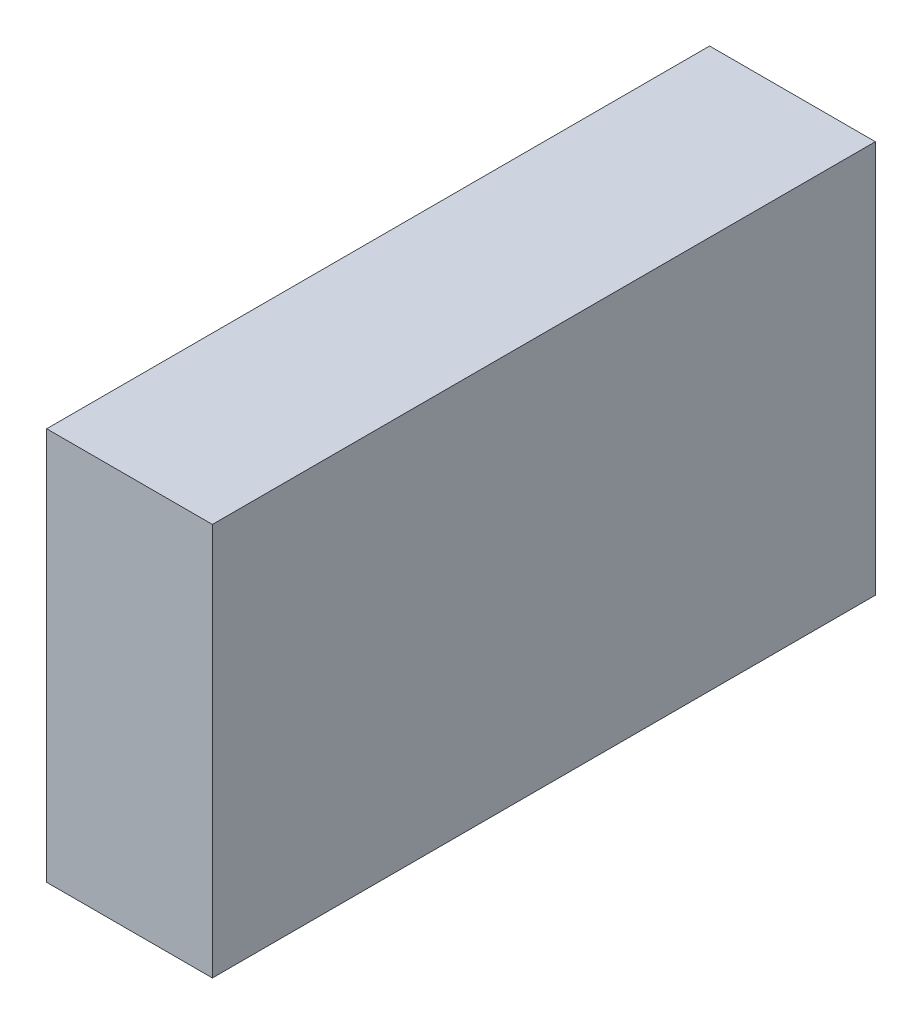
ISO-10303-21;
HEADER;
FILE_DESCRIPTION(('STEP AP214'),'2;1');
FILE_NAME('part.step','',(''),(''),'','','');
FILE_SCHEMA(('AUTOMOTIVE_DESIGN { 1 0 10303 214 1 1 1 1 }'));
ENDSEC;
DATA;
#1=APPLICATION_CONTEXT('core data for automotive mechanical design processes');
#2=APPLICATION_PROTOCOL_DEFINITION('international standard','automotive_design',2000,#1);
#3=PRODUCT_CONTEXT('',#1,'mechanical');
#4=PRODUCT('Part','Part','',(#3));
#5=PRODUCT_RELATED_PRODUCT_CATEGORY('part','',(#4));
#6=PRODUCT_DEFINITION_FORMATION('','',#4);
#7=PRODUCT_DEFINITION_CONTEXT('part definition',#1,'design');
#8=PRODUCT_DEFINITION('design','',#6,#7);
#9=PRODUCT_DEFINITION_SHAPE('','',#8);
#10=(LENGTH_UNIT() NAMED_UNIT(*) SI_UNIT(.MILLI.,.METRE.));
#11=(NAMED_UNIT(*) PLANE_ANGLE_UNIT() SI_UNIT($,.RADIAN.));
#12=(NAMED_UNIT(*) SI_UNIT($,.STERADIAN.) SOLID_ANGLE_UNIT());
#13=UNCERTAINTY_MEASURE_WITH_UNIT(LENGTH_MEASURE(1.E-05),#10,'distance_accuracy_value','');
#14=(GEOMETRIC_REPRESENTATION_CONTEXT(3) GLOBAL_UNCERTAINTY_ASSIGNED_CONTEXT((#13)) GLOBAL_UNIT_ASSIGNED_CONTEXT((#10,
#11,#12)) REPRESENTATION_CONTEXT('',''));
#15=CARTESIAN_POINT('',(0.,0.,0.));
#16=DIRECTION('',(0.,0.,1.));
#17=DIRECTION('',(1.,0.,0.));
#18=AXIS2_PLACEMENT_3D('',#15,#16,#17);
#19=CARTESIAN_POINT('',(10.,0.,0.));
#20=DIRECTION('',(0.,0.,-1.));
#21=DIRECTION('',(-1.,0.,0.));
#22=AXIS2_PLACEMENT_3D('',#19,#20,#21);
#23=PLANE('',#22);
#24=DIRECTION('',(0.,-1.,0.));
#25=VECTOR('',#24,1.);
#26=CARTESIAN_POINT('',(0.,0.,0.));
#27=LINE('',#26,#25);
#28=CARTESIAN_POINT('',(0.,23.7,0.));
#29=VERTEX_POINT('',#28);
#30=CARTESIAN_POINT('',(0.,0.,0.));
#31=VERTEX_POINT('',#30);
#32=EDGE_CURVE('E106',#29,#31,#27,.T.);
#33=ORIENTED_EDGE('',*,*,#32,.T.);
#34=DIRECTION('',(-1.,0.,0.));
#35=VECTOR('',#34,1.);
#36=CARTESIAN_POINT('',(10.,0.,0.));
#37=LINE('',#36,#35);
#38=CARTESIAN_POINT('',(10.,0.,0.));
#39=VERTEX_POINT('',#38);
#40=EDGE_CURVE('E11',#39,#31,#37,.T.);
#41=ORIENTED_EDGE('',*,*,#40,.F.);
#42=DIRECTION('',(0.,-1.,0.));
#43=VECTOR('',#42,1.);
#44=CARTESIAN_POINT('',(10.,0.,0.));
#45=LINE('',#44,#43);
#46=CARTESIAN_POINT('',(10.,23.7,0.));
#47=VERTEX_POINT('',#46);
#48=EDGE_CURVE('E92',#47,#39,#45,.T.);
#49=ORIENTED_EDGE('',*,*,#48,.F.);
#50=DIRECTION('',(-1.,0.,0.));
#51=VECTOR('',#50,1.);
#52=CARTESIAN_POINT('',(10.,23.7,0.));
#53=LINE('',#52,#51);
#54=EDGE_CURVE('E105',#47,#29,#53,.T.);
#55=ORIENTED_EDGE('',*,*,#54,.T.);
#56=EDGE_LOOP('',(#33,#41,#49,#55));
#57=FACE_BOUND('',#56,.T.);
#58=ADVANCED_FACE('F43',(#57),#23,.F.);
#59=CARTESIAN_POINT('',(10.,0.,0.));
#60=DIRECTION('',(0.,1.,0.));
#61=DIRECTION('',(0.,0.,1.));
#62=AXIS2_PLACEMENT_3D('',#59,#60,#61);
#63=PLANE('',#62);
#64=DIRECTION('',(0.,0.,-1.));
#65=VECTOR('',#64,1.);
#66=CARTESIAN_POINT('',(0.,0.,0.));
#67=LINE('',#66,#65);
#68=CARTESIAN_POINT('',(0.,0.,-40.));
#69=VERTEX_POINT('',#68);
#70=EDGE_CURVE('E97',#31,#69,#67,.T.);
#71=ORIENTED_EDGE('',*,*,#70,.T.);
#72=DIRECTION('',(-1.,0.,0.));
#73=VECTOR('',#72,1.);
#74=CARTESIAN_POINT('',(10.,0.,-40.));
#75=LINE('',#74,#73);
#76=CARTESIAN_POINT('',(10.,0.,-40.));
#77=VERTEX_POINT('',#76);
#78=EDGE_CURVE('E51',#77,#69,#75,.T.);
#79=ORIENTED_EDGE('',*,*,#78,.F.);
#80=DIRECTION('',(0.,0.,-1.));
#81=VECTOR('',#80,1.);
#82=CARTESIAN_POINT('',(10.,0.,0.));
#83=LINE('',#82,#81);
#84=EDGE_CURVE('E87',#39,#77,#83,.T.);
#85=ORIENTED_EDGE('',*,*,#84,.F.);
#86=ORIENTED_EDGE('',*,*,#40,.T.);
#87=EDGE_LOOP('',(#71,#79,#85,#86));
#88=FACE_BOUND('',#87,.T.);
#89=ADVANCED_FACE('F100',(#88),#63,.F.);
#90=CARTESIAN_POINT('',(10.,0.,-40.));
#91=DIRECTION('',(0.,0.,1.));
#92=DIRECTION('',(1.,0.,0.));
#93=AXIS2_PLACEMENT_3D('',#90,#91,#92);
#94=PLANE('',#93);
#95=DIRECTION('',(0.,1.,0.));
#96=VECTOR('',#95,1.);
#97=CARTESIAN_POINT('',(0.,0.,-40.));
#98=LINE('',#97,#96);
#99=CARTESIAN_POINT('',(0.,23.7,-40.));
#100=VERTEX_POINT('',#99);
#101=EDGE_CURVE('E78',#69,#100,#98,.T.);
#102=ORIENTED_EDGE('',*,*,#101,.T.);
#103=DIRECTION('',(-1.,0.,0.));
#104=VECTOR('',#103,1.);
#105=CARTESIAN_POINT('',(10.,23.7,-40.));
#106=LINE('',#105,#104);
#107=CARTESIAN_POINT('',(10.,23.7,-40.));
#108=VERTEX_POINT('',#107);
#109=EDGE_CURVE('E98',#108,#100,#106,.T.);
#110=ORIENTED_EDGE('',*,*,#109,.F.);
#111=DIRECTION('',(0.,1.,0.));
#112=VECTOR('',#111,1.);
#113=CARTESIAN_POINT('',(10.,0.,-40.));
#114=LINE('',#113,#112);
#115=EDGE_CURVE('E95',#77,#108,#114,.T.);
#116=ORIENTED_EDGE('',*,*,#115,.F.);
#117=ORIENTED_EDGE('',*,*,#78,.T.);
#118=EDGE_LOOP('',(#102,#110,#116,#117));
#119=FACE_BOUND('',#118,.T.);
#120=ADVANCED_FACE('F99',(#119),#94,.F.);
#121=CARTESIAN_POINT('',(10.,23.7,0.));
#122=DIRECTION('',(0.,-1.,0.));
#123=DIRECTION('',(0.,0.,-1.));
#124=AXIS2_PLACEMENT_3D('',#121,#122,#123);
#125=PLANE('',#124);
#126=DIRECTION('',(0.,0.,1.));
#127=VECTOR('',#126,1.);
#128=CARTESIAN_POINT('',(0.,23.7,0.));
#129=LINE('',#128,#127);
#130=EDGE_CURVE('E85',#100,#29,#129,.T.);
#131=ORIENTED_EDGE('',*,*,#130,.T.);
#132=ORIENTED_EDGE('',*,*,#54,.F.);
#133=DIRECTION('',(0.,0.,1.));
#134=VECTOR('',#133,1.);
#135=CARTESIAN_POINT('',(10.,23.7,0.));
#136=LINE('',#135,#134);
#137=EDGE_CURVE('E56',#108,#47,#136,.T.);
#138=ORIENTED_EDGE('',*,*,#137,.F.);
#139=ORIENTED_EDGE('',*,*,#109,.T.);
#140=EDGE_LOOP('',(#131,#132,#138,#139));
#141=FACE_BOUND('',#140,.T.);
#142=ADVANCED_FACE('F111',(#141),#125,.F.);
#143=CARTESIAN_POINT('',(10.,0.,0.));
#144=DIRECTION('',(-1.,0.,0.));
#145=DIRECTION('',(0.,0.,1.));
#146=AXIS2_PLACEMENT_3D('',#143,#144,#145);
#147=PLANE('',#146);
#148=ORIENTED_EDGE('',*,*,#48,.T.);
#149=ORIENTED_EDGE('',*,*,#84,.T.);
#150=ORIENTED_EDGE('',*,*,#115,.T.);
#151=ORIENTED_EDGE('',*,*,#137,.T.);
#152=EDGE_LOOP('',(#148,#149,#150,#151));
#153=FACE_BOUND('',#152,.T.);
#154=ADVANCED_FACE('F89',(#153),#147,.F.);
#155=CARTESIAN_POINT('',(0.,0.,0.));
#156=DIRECTION('',(-1.,0.,0.));
#157=DIRECTION('',(0.,0.,1.));
#158=AXIS2_PLACEMENT_3D('',#155,#156,#157);
#159=PLANE('',#158);
#160=ORIENTED_EDGE('',*,*,#32,.F.);
#161=ORIENTED_EDGE('',*,*,#130,.F.);
#162=ORIENTED_EDGE('',*,*,#101,.F.);
#163=ORIENTED_EDGE('',*,*,#70,.F.);
#164=EDGE_LOOP('',(#160,#161,#162,#163));
#165=FACE_BOUND('',#164,.T.);
#166=ADVANCED_FACE('F116',(#165),#159,.T.);
#167=CLOSED_SHELL('',(#58,#89,#120,#142,#154,#166));
#168=MANIFOLD_SOLID_BREP('B2',#167);
#169=ADVANCED_BREP_SHAPE_REPRESENTATION('',(#18,#168),#14);
#170=SHAPE_DEFINITION_REPRESENTATION(#9,#169);
ENDSEC;
END-ISO-10303-21;
